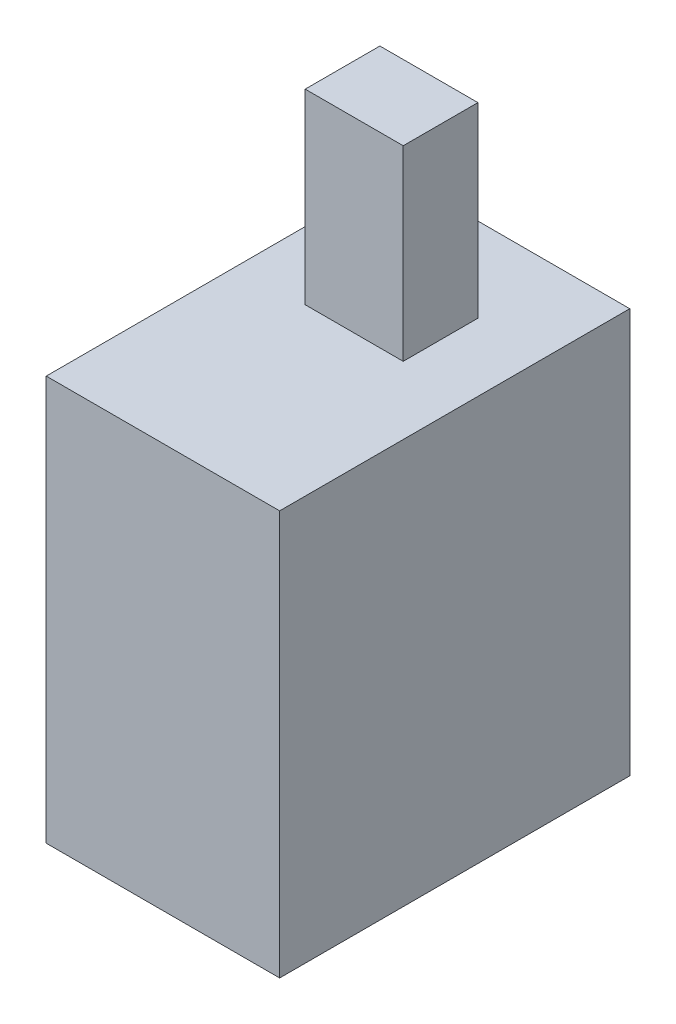
ISO-10303-21;
HEADER;
FILE_DESCRIPTION(('STEP AP214'),'2;1');
FILE_NAME('part.step','',(''),(''),'','','');
FILE_SCHEMA(('AUTOMOTIVE_DESIGN { 1 0 10303 214 1 1 1 1 }'));
ENDSEC;
DATA;
#1=APPLICATION_CONTEXT('core data for automotive mechanical design processes');
#2=APPLICATION_PROTOCOL_DEFINITION('international standard','automotive_design',2000,#1);
#3=PRODUCT_CONTEXT('',#1,'mechanical');
#4=PRODUCT('Part','Part','',(#3));
#5=PRODUCT_RELATED_PRODUCT_CATEGORY('part','',(#4));
#6=PRODUCT_DEFINITION_FORMATION('','',#4);
#7=PRODUCT_DEFINITION_CONTEXT('part definition',#1,'design');
#8=PRODUCT_DEFINITION('design','',#6,#7);
#9=PRODUCT_DEFINITION_SHAPE('','',#8);
#10=(LENGTH_UNIT() NAMED_UNIT(*) SI_UNIT(.MILLI.,.METRE.));
#11=(NAMED_UNIT(*) PLANE_ANGLE_UNIT() SI_UNIT($,.RADIAN.));
#12=(NAMED_UNIT(*) SI_UNIT($,.STERADIAN.) SOLID_ANGLE_UNIT());
#13=UNCERTAINTY_MEASURE_WITH_UNIT(LENGTH_MEASURE(1.E-05),#10,'distance_accuracy_value','');
#14=(GEOMETRIC_REPRESENTATION_CONTEXT(3) GLOBAL_UNCERTAINTY_ASSIGNED_CONTEXT((#13)) GLOBAL_UNIT_ASSIGNED_CONTEXT((#10,
#11,#12)) REPRESENTATION_CONTEXT('',''));
#15=CARTESIAN_POINT('',(0.,0.,0.));
#16=DIRECTION('',(0.,0.,1.));
#17=DIRECTION('',(1.,0.,0.));
#18=AXIS2_PLACEMENT_3D('',#15,#16,#17);
#19=CARTESIAN_POINT('',(0.,26.,0.));
#20=DIRECTION('',(0.,-1.,0.));
#21=DIRECTION('',(0.,0.,-1.));
#22=AXIS2_PLACEMENT_3D('',#19,#20,#21);
#23=PLANE('',#22);
#24=DIRECTION('',(0.,0.,1.));
#25=VECTOR('',#24,1.);
#26=CARTESIAN_POINT('',(0.,26.,0.));
#27=LINE('',#26,#25);
#28=CARTESIAN_POINT('',(0.,26.,-22.5));
#29=VERTEX_POINT('',#28);
#30=CARTESIAN_POINT('',(0.,26.,0.));
#31=VERTEX_POINT('',#30);
#32=EDGE_CURVE('E127',#29,#31,#27,.T.);
#33=ORIENTED_EDGE('',*,*,#32,.T.);
#34=DIRECTION('',(1.,0.,0.));
#35=VECTOR('',#34,1.);
#36=CARTESIAN_POINT('',(0.,26.,0.));
#37=LINE('',#36,#35);
#38=CARTESIAN_POINT('',(15.,26.,0.));
#39=VERTEX_POINT('',#38);
#40=EDGE_CURVE('E130',#31,#39,#37,.T.);
#41=ORIENTED_EDGE('',*,*,#40,.T.);
#42=DIRECTION('',(0.,0.,-1.));
#43=VECTOR('',#42,1.);
#44=CARTESIAN_POINT('',(15.,26.,0.));
#45=LINE('',#44,#43);
#46=CARTESIAN_POINT('',(15.,26.,-22.5));
#47=VERTEX_POINT('',#46);
#48=EDGE_CURVE('E133',#39,#47,#45,.T.);
#49=ORIENTED_EDGE('',*,*,#48,.T.);
#50=DIRECTION('',(-1.,0.,0.));
#51=VECTOR('',#50,1.);
#52=CARTESIAN_POINT('',(0.,26.,-22.5));
#53=LINE('',#52,#51);
#54=EDGE_CURVE('E135',#47,#29,#53,.T.);
#55=ORIENTED_EDGE('',*,*,#54,.T.);
#56=EDGE_LOOP('',(#33,#41,#49,#55));
#57=FACE_BOUND('',#56,.T.);
#58=DIRECTION('',(0.,0.,1.));
#59=VECTOR('',#58,1.);
#60=CARTESIAN_POINT('',(4.35,26.,-17.0915599249409));
#61=LINE('',#60,#59);
#62=CARTESIAN_POINT('',(4.35,26.,-17.0915599249409));
#63=VERTEX_POINT('',#62);
#64=CARTESIAN_POINT('',(4.35,26.,-12.2915599249409));
#65=VERTEX_POINT('',#64);
#66=EDGE_CURVE('E48',#63,#65,#61,.T.);
#67=ORIENTED_EDGE('',*,*,#66,.F.);
#68=DIRECTION('',(-1.,0.,0.));
#69=VECTOR('',#68,1.);
#70=CARTESIAN_POINT('',(4.35,26.,-17.0915599249409));
#71=LINE('',#70,#69);
#72=CARTESIAN_POINT('',(10.65,26.,-17.0915599249409));
#73=VERTEX_POINT('',#72);
#74=EDGE_CURVE('E52',#73,#63,#71,.T.);
#75=ORIENTED_EDGE('',*,*,#74,.F.);
#76=DIRECTION('',(0.,0.,-1.));
#77=VECTOR('',#76,1.);
#78=CARTESIAN_POINT('',(10.65,26.,-17.0915599249409));
#79=LINE('',#78,#77);
#80=CARTESIAN_POINT('',(10.65,26.,-12.2915599249409));
#81=VERTEX_POINT('',#80);
#82=EDGE_CURVE('E260',#81,#73,#79,.T.);
#83=ORIENTED_EDGE('',*,*,#82,.F.);
#84=DIRECTION('',(1.,0.,0.));
#85=VECTOR('',#84,1.);
#86=CARTESIAN_POINT('',(4.35,26.,-12.2915599249409));
#87=LINE('',#86,#85);
#88=EDGE_CURVE('E266',#65,#81,#87,.T.);
#89=ORIENTED_EDGE('',*,*,#88,.F.);
#90=EDGE_LOOP('',(#67,#75,#83,#89));
#91=FACE_BOUND('',#90,.T.);
#92=ADVANCED_FACE('F33',(#57,#91),#23,.F.);
#93=CARTESIAN_POINT('',(0.,26.,0.));
#94=DIRECTION('',(1.,0.,0.));
#95=DIRECTION('',(0.,0.,-1.));
#96=AXIS2_PLACEMENT_3D('',#93,#94,#95);
#97=PLANE('',#96);
#98=DIRECTION('',(0.,0.,1.));
#99=VECTOR('',#98,1.);
#100=CARTESIAN_POINT('',(0.,0.,0.));
#101=LINE('',#100,#99);
#102=CARTESIAN_POINT('',(0.,0.,-22.5));
#103=VERTEX_POINT('',#102);
#104=CARTESIAN_POINT('',(0.,0.,0.));
#105=VERTEX_POINT('',#104);
#106=EDGE_CURVE('E118',#103,#105,#101,.T.);
#107=ORIENTED_EDGE('',*,*,#106,.T.);
#108=DIRECTION('',(0.,-1.,0.));
#109=VECTOR('',#108,1.);
#110=CARTESIAN_POINT('',(0.,26.,0.));
#111=LINE('',#110,#109);
#112=EDGE_CURVE('E11',#31,#105,#111,.T.);
#113=ORIENTED_EDGE('',*,*,#112,.F.);
#114=ORIENTED_EDGE('',*,*,#32,.F.);
#115=DIRECTION('',(0.,-1.,0.));
#116=VECTOR('',#115,1.);
#117=CARTESIAN_POINT('',(0.,26.,-22.5));
#118=LINE('',#117,#116);
#119=EDGE_CURVE('E136',#29,#103,#118,.T.);
#120=ORIENTED_EDGE('',*,*,#119,.T.);
#121=EDGE_LOOP('',(#107,#113,#114,#120));
#122=FACE_BOUND('',#121,.T.);
#123=ADVANCED_FACE('F35',(#122),#97,.F.);
#124=CARTESIAN_POINT('',(0.,26.,0.));
#125=DIRECTION('',(0.,0.,-1.));
#126=DIRECTION('',(-1.,0.,0.));
#127=AXIS2_PLACEMENT_3D('',#124,#125,#126);
#128=PLANE('',#127);
#129=DIRECTION('',(1.,0.,0.));
#130=VECTOR('',#129,1.);
#131=CARTESIAN_POINT('',(0.,0.,0.));
#132=LINE('',#131,#130);
#133=CARTESIAN_POINT('',(15.,0.,0.));
#134=VERTEX_POINT('',#133);
#135=EDGE_CURVE('E121',#105,#134,#132,.T.);
#136=ORIENTED_EDGE('',*,*,#135,.T.);
#137=DIRECTION('',(0.,-1.,0.));
#138=VECTOR('',#137,1.);
#139=CARTESIAN_POINT('',(15.,26.,0.));
#140=LINE('',#139,#138);
#141=EDGE_CURVE('E41',#39,#134,#140,.T.);
#142=ORIENTED_EDGE('',*,*,#141,.F.);
#143=ORIENTED_EDGE('',*,*,#40,.F.);
#144=ORIENTED_EDGE('',*,*,#112,.T.);
#145=EDGE_LOOP('',(#136,#142,#143,#144));
#146=FACE_BOUND('',#145,.T.);
#147=ADVANCED_FACE('F166',(#146),#128,.F.);
#148=CARTESIAN_POINT('',(15.,26.,0.));
#149=DIRECTION('',(-1.,0.,0.));
#150=DIRECTION('',(0.,0.,1.));
#151=AXIS2_PLACEMENT_3D('',#148,#149,#150);
#152=PLANE('',#151);
#153=DIRECTION('',(0.,0.,-1.));
#154=VECTOR('',#153,1.);
#155=CARTESIAN_POINT('',(15.,0.,0.));
#156=LINE('',#155,#154);
#157=CARTESIAN_POINT('',(15.,0.,-22.5));
#158=VERTEX_POINT('',#157);
#159=EDGE_CURVE('E139',#134,#158,#156,.T.);
#160=ORIENTED_EDGE('',*,*,#159,.T.);
#161=DIRECTION('',(0.,-1.,0.));
#162=VECTOR('',#161,1.);
#163=CARTESIAN_POINT('',(15.,26.,-22.5));
#164=LINE('',#163,#162);
#165=EDGE_CURVE('E144',#47,#158,#164,.T.);
#166=ORIENTED_EDGE('',*,*,#165,.F.);
#167=ORIENTED_EDGE('',*,*,#48,.F.);
#168=ORIENTED_EDGE('',*,*,#141,.T.);
#169=EDGE_LOOP('',(#160,#166,#167,#168));
#170=FACE_BOUND('',#169,.T.);
#171=ADVANCED_FACE('F151',(#170),#152,.F.);
#172=CARTESIAN_POINT('',(0.,26.,-22.5));
#173=DIRECTION('',(0.,0.,1.));
#174=DIRECTION('',(1.,0.,0.));
#175=AXIS2_PLACEMENT_3D('',#172,#173,#174);
#176=PLANE('',#175);
#177=DIRECTION('',(-1.,0.,0.));
#178=VECTOR('',#177,1.);
#179=CARTESIAN_POINT('',(0.,0.,-22.5));
#180=LINE('',#179,#178);
#181=EDGE_CURVE('E131',#158,#103,#180,.T.);
#182=ORIENTED_EDGE('',*,*,#181,.T.);
#183=ORIENTED_EDGE('',*,*,#119,.F.);
#184=ORIENTED_EDGE('',*,*,#54,.F.);
#185=ORIENTED_EDGE('',*,*,#165,.T.);
#186=EDGE_LOOP('',(#182,#183,#184,#185));
#187=FACE_BOUND('',#186,.T.);
#188=ADVANCED_FACE('F160',(#187),#176,.F.);
#189=CARTESIAN_POINT('',(0.,0.,0.));
#190=DIRECTION('',(0.,-1.,0.));
#191=DIRECTION('',(0.,0.,-1.));
#192=AXIS2_PLACEMENT_3D('',#189,#190,#191);
#193=PLANE('',#192);
#194=ORIENTED_EDGE('',*,*,#106,.F.);
#195=ORIENTED_EDGE('',*,*,#181,.F.);
#196=ORIENTED_EDGE('',*,*,#159,.F.);
#197=ORIENTED_EDGE('',*,*,#135,.F.);
#198=EDGE_LOOP('',(#194,#195,#196,#197));
#199=FACE_BOUND('',#198,.T.);
#200=ADVANCED_FACE('F157',(#199),#193,.T.);
#201=CARTESIAN_POINT('',(4.35,38.,-17.0915599249409));
#202=DIRECTION('',(1.,0.,0.));
#203=DIRECTION('',(0.,0.,-1.));
#204=AXIS2_PLACEMENT_3D('',#201,#202,#203);
#205=PLANE('',#204);
#206=ORIENTED_EDGE('',*,*,#66,.T.);
#207=DIRECTION('',(0.,-1.,0.));
#208=VECTOR('',#207,1.);
#209=CARTESIAN_POINT('',(4.35,38.,-12.2915599249409));
#210=LINE('',#209,#208);
#211=CARTESIAN_POINT('',(4.35,38.,-12.2915599249409));
#212=VERTEX_POINT('',#211);
#213=EDGE_CURVE('E101',#212,#65,#210,.T.);
#214=ORIENTED_EDGE('',*,*,#213,.F.);
#215=DIRECTION('',(0.,0.,1.));
#216=VECTOR('',#215,1.);
#217=CARTESIAN_POINT('',(4.35,38.,-17.0915599249409));
#218=LINE('',#217,#216);
#219=CARTESIAN_POINT('',(4.35,38.,-17.0915599249409));
#220=VERTEX_POINT('',#219);
#221=EDGE_CURVE('E107',#220,#212,#218,.T.);
#222=ORIENTED_EDGE('',*,*,#221,.F.);
#223=DIRECTION('',(0.,-1.,0.));
#224=VECTOR('',#223,1.);
#225=CARTESIAN_POINT('',(4.35,38.,-17.0915599249409));
#226=LINE('',#225,#224);
#227=EDGE_CURVE('E258',#220,#63,#226,.T.);
#228=ORIENTED_EDGE('',*,*,#227,.T.);
#229=EDGE_LOOP('',(#206,#214,#222,#228));
#230=FACE_BOUND('',#229,.T.);
#231=ADVANCED_FACE('F117',(#230),#205,.F.);
#232=CARTESIAN_POINT('',(4.35,38.,-12.2915599249409));
#233=DIRECTION('',(0.,0.,-1.));
#234=DIRECTION('',(-1.,0.,0.));
#235=AXIS2_PLACEMENT_3D('',#232,#233,#234);
#236=PLANE('',#235);
#237=ORIENTED_EDGE('',*,*,#88,.T.);
#238=DIRECTION('',(0.,-1.,0.));
#239=VECTOR('',#238,1.);
#240=CARTESIAN_POINT('',(10.65,38.,-12.2915599249409));
#241=LINE('',#240,#239);
#242=CARTESIAN_POINT('',(10.65,38.,-12.2915599249409));
#243=VERTEX_POINT('',#242);
#244=EDGE_CURVE('E103',#243,#81,#241,.T.);
#245=ORIENTED_EDGE('',*,*,#244,.F.);
#246=DIRECTION('',(1.,0.,0.));
#247=VECTOR('',#246,1.);
#248=CARTESIAN_POINT('',(4.35,38.,-12.2915599249409));
#249=LINE('',#248,#247);
#250=EDGE_CURVE('E96',#212,#243,#249,.T.);
#251=ORIENTED_EDGE('',*,*,#250,.F.);
#252=ORIENTED_EDGE('',*,*,#213,.T.);
#253=EDGE_LOOP('',(#237,#245,#251,#252));
#254=FACE_BOUND('',#253,.T.);
#255=ADVANCED_FACE('F99',(#254),#236,.F.);
#256=CARTESIAN_POINT('',(10.65,38.,-17.0915599249409));
#257=DIRECTION('',(-1.,0.,0.));
#258=DIRECTION('',(0.,0.,1.));
#259=AXIS2_PLACEMENT_3D('',#256,#257,#258);
#260=PLANE('',#259);
#261=ORIENTED_EDGE('',*,*,#82,.T.);
#262=DIRECTION('',(0.,-1.,0.));
#263=VECTOR('',#262,1.);
#264=CARTESIAN_POINT('',(10.65,38.,-17.0915599249409));
#265=LINE('',#264,#263);
#266=CARTESIAN_POINT('',(10.65,38.,-17.0915599249409));
#267=VERTEX_POINT('',#266);
#268=EDGE_CURVE('E123',#267,#73,#265,.T.);
#269=ORIENTED_EDGE('',*,*,#268,.F.);
#270=DIRECTION('',(0.,0.,-1.));
#271=VECTOR('',#270,1.);
#272=CARTESIAN_POINT('',(10.65,38.,-17.0915599249409));
#273=LINE('',#272,#271);
#274=EDGE_CURVE('E106',#243,#267,#273,.T.);
#275=ORIENTED_EDGE('',*,*,#274,.F.);
#276=ORIENTED_EDGE('',*,*,#244,.T.);
#277=EDGE_LOOP('',(#261,#269,#275,#276));
#278=FACE_BOUND('',#277,.T.);
#279=ADVANCED_FACE('F202',(#278),#260,.F.);
#280=CARTESIAN_POINT('',(4.35,38.,-17.0915599249409));
#281=DIRECTION('',(0.,0.,1.));
#282=DIRECTION('',(1.,0.,0.));
#283=AXIS2_PLACEMENT_3D('',#280,#281,#282);
#284=PLANE('',#283);
#285=ORIENTED_EDGE('',*,*,#74,.T.);
#286=ORIENTED_EDGE('',*,*,#227,.F.);
#287=DIRECTION('',(-1.,0.,0.));
#288=VECTOR('',#287,1.);
#289=CARTESIAN_POINT('',(4.35,38.,-17.0915599249409));
#290=LINE('',#289,#288);
#291=EDGE_CURVE('E112',#267,#220,#290,.T.);
#292=ORIENTED_EDGE('',*,*,#291,.F.);
#293=ORIENTED_EDGE('',*,*,#268,.T.);
#294=EDGE_LOOP('',(#285,#286,#292,#293));
#295=FACE_BOUND('',#294,.T.);
#296=ADVANCED_FACE('F208',(#295),#284,.F.);
#297=CARTESIAN_POINT('',(0.,38.,0.));
#298=DIRECTION('',(0.,1.,0.));
#299=DIRECTION('',(0.,0.,1.));
#300=AXIS2_PLACEMENT_3D('',#297,#298,#299);
#301=PLANE('',#300);
#302=ORIENTED_EDGE('',*,*,#221,.T.);
#303=ORIENTED_EDGE('',*,*,#250,.T.);
#304=ORIENTED_EDGE('',*,*,#274,.T.);
#305=ORIENTED_EDGE('',*,*,#291,.T.);
#306=EDGE_LOOP('',(#302,#303,#304,#305));
#307=FACE_BOUND('',#306,.T.);
#308=ADVANCED_FACE('F110',(#307),#301,.T.);
#309=CLOSED_SHELL('',(#92,#123,#147,#171,#188,#200,#231,#255,#279,#296,#308));
#310=MANIFOLD_SOLID_BREP('B2',#309);
#311=ADVANCED_BREP_SHAPE_REPRESENTATION('',(#18,#310),#14);
#312=SHAPE_DEFINITION_REPRESENTATION(#9,#311);
ENDSEC;
END-ISO-10303-21;
